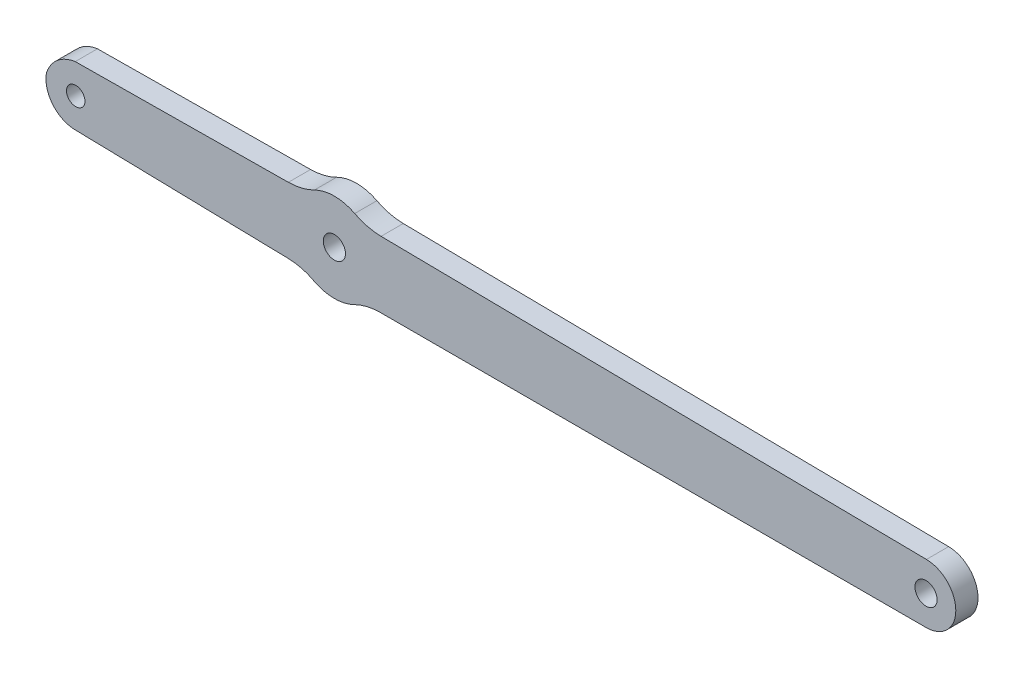
ISO-10303-21;
HEADER;
FILE_DESCRIPTION(('STEP AP214'),'2;1');
FILE_NAME('part.step','',(''),(''),'','','');
FILE_SCHEMA(('AUTOMOTIVE_DESIGN { 1 0 10303 214 1 1 1 1 }'));
ENDSEC;
DATA;
#1=APPLICATION_CONTEXT('core data for automotive mechanical design processes');
#2=APPLICATION_PROTOCOL_DEFINITION('international standard','automotive_design',2000,#1);
#3=PRODUCT_CONTEXT('',#1,'mechanical');
#4=PRODUCT('Part','Part','',(#3));
#5=PRODUCT_RELATED_PRODUCT_CATEGORY('part','',(#4));
#6=PRODUCT_DEFINITION_FORMATION('','',#4);
#7=PRODUCT_DEFINITION_CONTEXT('part definition',#1,'design');
#8=PRODUCT_DEFINITION('design','',#6,#7);
#9=PRODUCT_DEFINITION_SHAPE('','',#8);
#10=(LENGTH_UNIT() NAMED_UNIT(*) SI_UNIT(.MILLI.,.METRE.));
#11=(NAMED_UNIT(*) PLANE_ANGLE_UNIT() SI_UNIT($,.RADIAN.));
#12=(NAMED_UNIT(*) SI_UNIT($,.STERADIAN.) SOLID_ANGLE_UNIT());
#13=UNCERTAINTY_MEASURE_WITH_UNIT(LENGTH_MEASURE(1.E-05),#10,'distance_accuracy_value','');
#14=(GEOMETRIC_REPRESENTATION_CONTEXT(3) GLOBAL_UNCERTAINTY_ASSIGNED_CONTEXT((#13)) GLOBAL_UNIT_ASSIGNED_CONTEXT((#10,
#11,#12)) REPRESENTATION_CONTEXT('',''));
#15=CARTESIAN_POINT('',(0.,0.,0.));
#16=DIRECTION('',(0.,0.,1.));
#17=DIRECTION('',(1.,0.,0.));
#18=AXIS2_PLACEMENT_3D('',#15,#16,#17);
#19=CARTESIAN_POINT('',(281.772915584096,152.423239641116,3.));
#20=DIRECTION('',(0.,0.,1.));
#21=DIRECTION('',(1.,0.,0.));
#22=AXIS2_PLACEMENT_3D('',#19,#20,#21);
#23=PLANE('',#22);
#24=CARTESIAN_POINT('',(201.748350523877,152.944502056133,3.));
#25=DIRECTION('',(0.,0.,1.));
#26=DIRECTION('',(1.,0.,0.));
#27=AXIS2_PLACEMENT_3D('',#24,#25,#26);
#28=CIRCLE('',#27,1.5);
#29=CARTESIAN_POINT('',(203.248350523877,152.944502056133,3.));
#30=VERTEX_POINT('',#29);
#31=EDGE_CURVE('E266',#30,#30,#28,.T.);
#32=ORIENTED_EDGE('',*,*,#31,.F.);
#33=EDGE_LOOP('',(#32));
#34=FACE_BOUND('',#33,.T.);
#35=DIRECTION('',(0.9999999979286,6.43645915177105E-05,0.));
#36=VECTOR('',#35,1.);
#37=CARTESIAN_POINT('',(273.299347779071,148.423065382531,3.));
#38=LINE('',#37,#36);
#39=CARTESIAN_POINT('',(208.001547460763,148.418862516295,3.));
#40=VERTEX_POINT('',#39);
#41=CARTESIAN_POINT('',(281.799361624843,148.423612482449,3.));
#42=VERTEX_POINT('',#41);
#43=EDGE_CURVE('E50',#40,#42,#38,.T.);
#44=ORIENTED_EDGE('',*,*,#43,.T.);
#45=CARTESIAN_POINT('',(281.772915584096,152.423239641116,3.));
#46=DIRECTION('',(0.,0.,1.));
#47=DIRECTION('',(1.,0.,0.));
#48=AXIS2_PLACEMENT_3D('',#45,#46,#47);
#49=CIRCLE('',#48,3.99971458999486);
#50=CARTESIAN_POINT('',(281.799039077792,156.422868919498,3.));
#51=VERTEX_POINT('',#50);
#52=EDGE_CURVE('E259',#42,#51,#49,.T.);
#53=ORIENTED_EDGE('',*,*,#52,.T.);
#54=DIRECTION('',(-0.999914327574007,0.0130895955713542,0.));
#55=VECTOR('',#54,1.);
#56=CARTESIAN_POINT('',(281.799039077792,156.422868919498,3.));
#57=LINE('',#56,#55);
#58=CARTESIAN_POINT('',(208.059957025033,157.388166380747,3.));
#59=VERTEX_POINT('',#58);
#60=EDGE_CURVE('E215',#51,#59,#57,.T.);
#61=ORIENTED_EDGE('',*,*,#60,.T.);
#62=CARTESIAN_POINT('',(208.164874301942,165.388122879638,3.));
#63=DIRECTION('',(0.,0.,-1.));
#64=DIRECTION('',(1.,0.,0.));
#65=AXIS2_PLACEMENT_3D('',#62,#63,#64);
#66=CIRCLE('',#65,8.0006444502392);
#67=CARTESIAN_POINT('',(204.498188507489,158.277164652795,3.));
#68=VERTEX_POINT('',#67);
#69=EDGE_CURVE('E234',#59,#68,#66,.T.);
#70=ORIENTED_EDGE('',*,*,#69,.T.);
#71=CARTESIAN_POINT('',(201.748291362137,152.944826169237,3.));
#72=DIRECTION('',(0.,0.,1.));
#73=DIRECTION('',(1.,0.,0.));
#74=AXIS2_PLACEMENT_3D('',#71,#72,#73);
#75=CIRCLE('',#74,5.99964732407237);
#76=CARTESIAN_POINT('',(199.049261051765,158.303091130672,3.));
#77=VERTEX_POINT('',#76);
#78=EDGE_CURVE('E231',#68,#77,#75,.T.);
#79=ORIENTED_EDGE('',*,*,#78,.T.);
#80=CARTESIAN_POINT('',(195.446483359954,165.464583115021,3.));
#81=DIRECTION('',(0.,0.,-1.));
#82=DIRECTION('',(1.,0.,0.));
#83=AXIS2_PLACEMENT_3D('',#80,#81,#82);
#84=CIRCLE('',#83,8.01666854363488);
#85=CARTESIAN_POINT('',(195.527170705693,157.448320638608,3.));
#86=VERTEX_POINT('',#85);
#87=EDGE_CURVE('E233',#77,#86,#84,.T.);
#88=ORIENTED_EDGE('',*,*,#87,.T.);
#89=DIRECTION('',(-0.999954125619551,-0.00957844749632592,0.));
#90=VECTOR('',#89,1.);
#91=CARTESIAN_POINT('',(195.527170705693,157.448320638608,3.));
#92=LINE('',#91,#90);
#93=CARTESIAN_POINT('',(166.710788830161,157.172291775126,3.));
#94=VERTEX_POINT('',#93);
#95=EDGE_CURVE('E236',#86,#94,#92,.T.);
#96=ORIENTED_EDGE('',*,*,#95,.T.);
#97=CARTESIAN_POINT('',(167.348845761118,152.45935869731,3.));
#98=DIRECTION('',(0.,0.,1.));
#99=DIRECTION('',(1.,0.,0.));
#100=AXIS2_PLACEMENT_3D('',#97,#98,#99);
#101=CIRCLE('',#100,4.75592838919132);
#102=CARTESIAN_POINT('',(162.814944056756,153.895530754657,3.));
#103=VERTEX_POINT('',#102);
#104=EDGE_CURVE('E242',#94,#103,#101,.T.);
#105=ORIENTED_EDGE('',*,*,#104,.T.);
#106=CARTESIAN_POINT('',(166.749053074586,153.172471185027,3.));
#107=DIRECTION('',(0.,0.,1.));
#108=DIRECTION('',(1.,0.,0.));
#109=AXIS2_PLACEMENT_3D('',#106,#107,#108);
#110=CIRCLE('',#109,4.00000361317369);
#111=CARTESIAN_POINT('',(166.658683266735,149.173488539,3.));
#112=VERTEX_POINT('',#111);
#113=EDGE_CURVE('E244',#103,#112,#110,.T.);
#114=ORIENTED_EDGE('',*,*,#113,.T.);
#115=DIRECTION('',(0.999744437235561,-0.022606640983402,0.));
#116=VECTOR('',#115,1.);
#117=CARTESIAN_POINT('',(166.658683266735,149.173488539,3.));
#118=LINE('',#117,#116);
#119=CARTESIAN_POINT('',(195.469024019773,148.522017017123,3.));
#120=VERTEX_POINT('',#119);
#121=EDGE_CURVE('E141',#112,#120,#118,.T.);
#122=ORIENTED_EDGE('',*,*,#121,.T.);
#123=CARTESIAN_POINT('',(195.404462461964,140.977557248785,3.));
#124=DIRECTION('',(0.,0.,-1.));
#125=DIRECTION('',(1.,0.,0.));
#126=AXIS2_PLACEMENT_3D('',#123,#124,#125);
#127=CIRCLE('',#126,7.54473600537629);
#128=CARTESIAN_POINT('',(198.979735895979,147.621386059256,3.));
#129=VERTEX_POINT('',#128);
#130=EDGE_CURVE('E135',#120,#129,#127,.T.);
#131=ORIENTED_EDGE('',*,*,#130,.T.);
#132=CARTESIAN_POINT('',(201.748298232716,152.944482473481,3.));
#133=DIRECTION('',(0.,0.,1.));
#134=DIRECTION('',(1.,0.,0.));
#135=AXIS2_PLACEMENT_3D('',#132,#133,#134);
#136=CIRCLE('',#135,6.00002440391188);
#137=CARTESIAN_POINT('',(204.428513331861,147.576359908761,3.));
#138=VERTEX_POINT('',#137);
#139=EDGE_CURVE('E139',#129,#138,#136,.T.);
#140=ORIENTED_EDGE('',*,*,#139,.T.);
#141=CARTESIAN_POINT('',(208.002206612325,140.418238095968,3.));
#142=DIRECTION('',(0.,0.,-1.));
#143=DIRECTION('',(1.,0.,0.));
#144=AXIS2_PLACEMENT_3D('',#141,#142,#143);
#145=CIRCLE('',#144,8.00062444748054);
#146=EDGE_CURVE('E155',#138,#40,#145,.T.);
#147=ORIENTED_EDGE('',*,*,#146,.T.);
#148=EDGE_LOOP('',(#44,#53,#61,#70,#79,#88,#96,#105,#114,#122,#131,#140,#147));
#149=FACE_BOUND('',#148,.T.);
#150=CARTESIAN_POINT('',(281.74663143718,152.423262481954,3.));
#151=DIRECTION('',(0.,0.,1.));
#152=DIRECTION('',(1.,0.,0.));
#153=AXIS2_PLACEMENT_3D('',#150,#151,#152);
#154=CIRCLE('',#153,1.50000000000009);
#155=CARTESIAN_POINT('',(283.24663143718,152.423262481954,3.));
#156=VERTEX_POINT('',#155);
#157=EDGE_CURVE('E164',#156,#156,#154,.T.);
#158=ORIENTED_EDGE('',*,*,#157,.F.);
#159=EDGE_LOOP('',(#158));
#160=FACE_BOUND('',#159,.T.);
#161=CARTESIAN_POINT('',(166.775315589097,153.179339639449,3.));
#162=DIRECTION('',(0.,0.,1.));
#163=DIRECTION('',(1.,0.,0.));
#164=AXIS2_PLACEMENT_3D('',#161,#162,#163);
#165=CIRCLE('',#164,1.25000000000001);
#166=CARTESIAN_POINT('',(168.025315589097,153.179339639449,3.));
#167=VERTEX_POINT('',#166);
#168=EDGE_CURVE('E272',#167,#167,#165,.T.);
#169=ORIENTED_EDGE('',*,*,#168,.F.);
#170=EDGE_LOOP('',(#169));
#171=FACE_BOUND('',#170,.T.);
#172=ADVANCED_FACE('F33',(#34,#149,#160,#171),#23,.T.);
#173=CARTESIAN_POINT('',(281.772915584096,152.423239641116,0.));
#174=DIRECTION('',(0.,0.,1.));
#175=DIRECTION('',(1.,0.,0.));
#176=AXIS2_PLACEMENT_3D('',#173,#174,#175);
#177=PLANE('',#176);
#178=CARTESIAN_POINT('',(281.772915584096,152.423239641116,0.));
#179=DIRECTION('',(0.,0.,1.));
#180=DIRECTION('',(1.,0.,0.));
#181=AXIS2_PLACEMENT_3D('',#178,#179,#180);
#182=CIRCLE('',#181,3.99971458999486);
#183=CARTESIAN_POINT('',(281.799361624843,148.423612482449,0.));
#184=VERTEX_POINT('',#183);
#185=CARTESIAN_POINT('',(281.799039077792,156.422868919498,0.));
#186=VERTEX_POINT('',#185);
#187=EDGE_CURVE('E161',#184,#186,#182,.T.);
#188=ORIENTED_EDGE('',*,*,#187,.F.);
#189=DIRECTION('',(0.9999999979286,6.43645912575713E-05,0.));
#190=VECTOR('',#189,1.);
#191=CARTESIAN_POINT('',(245.400454541767,148.421269681667,0.));
#192=LINE('',#191,#190);
#193=CARTESIAN_POINT('',(208.001547460763,148.418862516295,0.));
#194=VERTEX_POINT('',#193);
#195=EDGE_CURVE('E102',#194,#184,#192,.T.);
#196=ORIENTED_EDGE('',*,*,#195,.F.);
#197=CARTESIAN_POINT('',(208.002206612325,140.418238095968,0.));
#198=DIRECTION('',(0.,0.,-1.));
#199=DIRECTION('',(1.,0.,0.));
#200=AXIS2_PLACEMENT_3D('',#197,#198,#199);
#201=CIRCLE('',#200,8.00062444748054);
#202=CARTESIAN_POINT('',(204.428513331861,147.576359908761,0.));
#203=VERTEX_POINT('',#202);
#204=EDGE_CURVE('E182',#203,#194,#201,.T.);
#205=ORIENTED_EDGE('',*,*,#204,.F.);
#206=CARTESIAN_POINT('',(201.748298232716,152.944482473481,0.));
#207=DIRECTION('',(0.,0.,1.));
#208=DIRECTION('',(1.,0.,0.));
#209=AXIS2_PLACEMENT_3D('',#206,#207,#208);
#210=CIRCLE('',#209,6.00002440391188);
#211=CARTESIAN_POINT('',(198.979735895979,147.621386059256,0.));
#212=VERTEX_POINT('',#211);
#213=EDGE_CURVE('E95',#212,#203,#210,.T.);
#214=ORIENTED_EDGE('',*,*,#213,.F.);
#215=CARTESIAN_POINT('',(195.404462461964,140.977557248785,0.));
#216=DIRECTION('',(0.,0.,-1.));
#217=DIRECTION('',(1.,0.,0.));
#218=AXIS2_PLACEMENT_3D('',#215,#216,#217);
#219=CIRCLE('',#218,7.54473600537629);
#220=CARTESIAN_POINT('',(195.469024019773,148.522017017123,0.));
#221=VERTEX_POINT('',#220);
#222=EDGE_CURVE('E149',#221,#212,#219,.T.);
#223=ORIENTED_EDGE('',*,*,#222,.F.);
#224=DIRECTION('',(0.999744437235561,-0.022606640983402,0.));
#225=VECTOR('',#224,1.);
#226=CARTESIAN_POINT('',(166.658683266735,149.173488539,0.));
#227=LINE('',#226,#225);
#228=CARTESIAN_POINT('',(166.658683266735,149.173488539,0.));
#229=VERTEX_POINT('',#228);
#230=EDGE_CURVE('E178',#229,#221,#227,.T.);
#231=ORIENTED_EDGE('',*,*,#230,.F.);
#232=CARTESIAN_POINT('',(166.749053074586,153.172471185027,0.));
#233=DIRECTION('',(0.,0.,1.));
#234=DIRECTION('',(1.,0.,0.));
#235=AXIS2_PLACEMENT_3D('',#232,#233,#234);
#236=CIRCLE('',#235,4.00000361317369);
#237=CARTESIAN_POINT('',(162.814944056756,153.895530754657,0.));
#238=VERTEX_POINT('',#237);
#239=EDGE_CURVE('E176',#238,#229,#236,.T.);
#240=ORIENTED_EDGE('',*,*,#239,.F.);
#241=CARTESIAN_POINT('',(167.348845761118,152.45935869731,0.));
#242=DIRECTION('',(0.,0.,1.));
#243=DIRECTION('',(1.,0.,0.));
#244=AXIS2_PLACEMENT_3D('',#241,#242,#243);
#245=CIRCLE('',#244,4.75592838919132);
#246=CARTESIAN_POINT('',(166.710788830161,157.172291775126,0.));
#247=VERTEX_POINT('',#246);
#248=EDGE_CURVE('E174',#247,#238,#245,.T.);
#249=ORIENTED_EDGE('',*,*,#248,.F.);
#250=DIRECTION('',(-0.999954125619551,-0.00957844749632592,0.));
#251=VECTOR('',#250,1.);
#252=CARTESIAN_POINT('',(195.527170705693,157.448320638608,0.));
#253=LINE('',#252,#251);
#254=CARTESIAN_POINT('',(195.527170705693,157.448320638608,0.));
#255=VERTEX_POINT('',#254);
#256=EDGE_CURVE('E172',#255,#247,#253,.T.);
#257=ORIENTED_EDGE('',*,*,#256,.F.);
#258=CARTESIAN_POINT('',(195.446483359954,165.464583115021,0.));
#259=DIRECTION('',(0.,0.,-1.));
#260=DIRECTION('',(1.,0.,0.));
#261=AXIS2_PLACEMENT_3D('',#258,#259,#260);
#262=CIRCLE('',#261,8.01666854363488);
#263=CARTESIAN_POINT('',(199.049261051765,158.303091130672,0.));
#264=VERTEX_POINT('',#263);
#265=EDGE_CURVE('E170',#264,#255,#262,.T.);
#266=ORIENTED_EDGE('',*,*,#265,.F.);
#267=CARTESIAN_POINT('',(201.748291362137,152.944826169237,0.));
#268=DIRECTION('',(0.,0.,1.));
#269=DIRECTION('',(1.,0.,0.));
#270=AXIS2_PLACEMENT_3D('',#267,#268,#269);
#271=CIRCLE('',#270,5.99964732407237);
#272=CARTESIAN_POINT('',(204.498188507489,158.277164652795,0.));
#273=VERTEX_POINT('',#272);
#274=EDGE_CURVE('E168',#273,#264,#271,.T.);
#275=ORIENTED_EDGE('',*,*,#274,.F.);
#276=CARTESIAN_POINT('',(208.164874301942,165.388122879638,0.));
#277=DIRECTION('',(0.,0.,-1.));
#278=DIRECTION('',(1.,0.,0.));
#279=AXIS2_PLACEMENT_3D('',#276,#277,#278);
#280=CIRCLE('',#279,8.0006444502392);
#281=CARTESIAN_POINT('',(208.059957025033,157.388166380747,0.));
#282=VERTEX_POINT('',#281);
#283=EDGE_CURVE('E166',#282,#273,#280,.T.);
#284=ORIENTED_EDGE('',*,*,#283,.F.);
#285=DIRECTION('',(-0.999914327574007,0.0130895955713542,0.));
#286=VECTOR('',#285,1.);
#287=CARTESIAN_POINT('',(281.799039077792,156.422868919498,0.));
#288=LINE('',#287,#286);
#289=EDGE_CURVE('E163',#186,#282,#288,.T.);
#290=ORIENTED_EDGE('',*,*,#289,.F.);
#291=EDGE_LOOP('',(#188,#196,#205,#214,#223,#231,#240,#249,#257,#266,#275,#284,#290));
#292=FACE_BOUND('',#291,.T.);
#293=CARTESIAN_POINT('',(281.74663143718,152.423262481954,0.));
#294=DIRECTION('',(0.,0.,1.));
#295=DIRECTION('',(1.,0.,0.));
#296=AXIS2_PLACEMENT_3D('',#293,#294,#295);
#297=CIRCLE('',#296,1.50000000000009);
#298=CARTESIAN_POINT('',(283.24663143718,152.423262481954,0.));
#299=VERTEX_POINT('',#298);
#300=EDGE_CURVE('E263',#299,#299,#297,.T.);
#301=ORIENTED_EDGE('',*,*,#300,.T.);
#302=EDGE_LOOP('',(#301));
#303=FACE_BOUND('',#302,.T.);
#304=CARTESIAN_POINT('',(201.748350523877,152.944502056133,0.));
#305=DIRECTION('',(0.,0.,1.));
#306=DIRECTION('',(1.,0.,0.));
#307=AXIS2_PLACEMENT_3D('',#304,#305,#306);
#308=CIRCLE('',#307,1.5);
#309=CARTESIAN_POINT('',(203.248350523877,152.944502056133,0.));
#310=VERTEX_POINT('',#309);
#311=EDGE_CURVE('E269',#310,#310,#308,.T.);
#312=ORIENTED_EDGE('',*,*,#311,.T.);
#313=EDGE_LOOP('',(#312));
#314=FACE_BOUND('',#313,.T.);
#315=CARTESIAN_POINT('',(166.775315589097,153.179339639449,0.));
#316=DIRECTION('',(0.,0.,1.));
#317=DIRECTION('',(1.,0.,0.));
#318=AXIS2_PLACEMENT_3D('',#315,#316,#317);
#319=CIRCLE('',#318,1.25000000000001);
#320=CARTESIAN_POINT('',(168.025315589097,153.179339639449,0.));
#321=VERTEX_POINT('',#320);
#322=EDGE_CURVE('E275',#321,#321,#319,.T.);
#323=ORIENTED_EDGE('',*,*,#322,.T.);
#324=EDGE_LOOP('',(#323));
#325=FACE_BOUND('',#324,.T.);
#326=ADVANCED_FACE('F219',(#292,#303,#314,#325),#177,.F.);
#327=CARTESIAN_POINT('',(281.772915584096,152.423239641116,3.));
#328=DIRECTION('',(0.,0.,-1.));
#329=DIRECTION('',(-1.,0.,0.));
#330=AXIS2_PLACEMENT_3D('',#327,#328,#329);
#331=CYLINDRICAL_SURFACE('',#330,3.99971458999486);
#332=ORIENTED_EDGE('',*,*,#187,.T.);
#333=DIRECTION('',(0.,0.,-1.));
#334=VECTOR('',#333,1.);
#335=CARTESIAN_POINT('',(281.799039077792,156.422868919498,3.));
#336=LINE('',#335,#334);
#337=EDGE_CURVE('E42',#51,#186,#336,.T.);
#338=ORIENTED_EDGE('',*,*,#337,.F.);
#339=ORIENTED_EDGE('',*,*,#52,.F.);
#340=DIRECTION('',(0.,0.,-1.));
#341=VECTOR('',#340,1.);
#342=CARTESIAN_POINT('',(281.799361624843,148.423612482449,3.));
#343=LINE('',#342,#341);
#344=EDGE_CURVE('E11',#42,#184,#343,.T.);
#345=ORIENTED_EDGE('',*,*,#344,.T.);
#346=EDGE_LOOP('',(#332,#338,#339,#345));
#347=FACE_BOUND('',#346,.T.);
#348=ADVANCED_FACE('F35',(#347),#331,.T.);
#349=CARTESIAN_POINT('',(281.799039077792,156.422868919498,3.));
#350=DIRECTION('',(-0.0130895955713542,-0.999914327574007,0.));
#351=DIRECTION('',(0.999914327574007,-0.0130895955713542,0.));
#352=AXIS2_PLACEMENT_3D('',#349,#350,#351);
#353=PLANE('',#352);
#354=ORIENTED_EDGE('',*,*,#289,.T.);
#355=DIRECTION('',(0.,0.,-1.));
#356=VECTOR('',#355,1.);
#357=CARTESIAN_POINT('',(208.059957025033,157.388166380747,3.));
#358=LINE('',#357,#356);
#359=EDGE_CURVE('E206',#59,#282,#358,.T.);
#360=ORIENTED_EDGE('',*,*,#359,.F.);
#361=ORIENTED_EDGE('',*,*,#60,.F.);
#362=ORIENTED_EDGE('',*,*,#337,.T.);
#363=EDGE_LOOP('',(#354,#360,#361,#362));
#364=FACE_BOUND('',#363,.T.);
#365=ADVANCED_FACE('F213',(#364),#353,.F.);
#366=CARTESIAN_POINT('',(208.164874301942,165.388122879638,3.));
#367=DIRECTION('',(0.,0.,-1.));
#368=DIRECTION('',(-1.,0.,0.));
#369=AXIS2_PLACEMENT_3D('',#366,#367,#368);
#370=CYLINDRICAL_SURFACE('',#369,8.0006444502392);
#371=ORIENTED_EDGE('',*,*,#283,.T.);
#372=DIRECTION('',(0.,0.,-1.));
#373=VECTOR('',#372,1.);
#374=CARTESIAN_POINT('',(204.498188507489,158.277164652795,3.));
#375=LINE('',#374,#373);
#376=EDGE_CURVE('E203',#68,#273,#375,.T.);
#377=ORIENTED_EDGE('',*,*,#376,.F.);
#378=ORIENTED_EDGE('',*,*,#69,.F.);
#379=ORIENTED_EDGE('',*,*,#359,.T.);
#380=EDGE_LOOP('',(#371,#377,#378,#379));
#381=FACE_BOUND('',#380,.T.);
#382=ADVANCED_FACE('F225',(#381),#370,.F.);
#383=CARTESIAN_POINT('',(201.748291362137,152.944826169237,3.));
#384=DIRECTION('',(0.,0.,-1.));
#385=DIRECTION('',(-1.,0.,0.));
#386=AXIS2_PLACEMENT_3D('',#383,#384,#385);
#387=CYLINDRICAL_SURFACE('',#386,5.99964732407237);
#388=ORIENTED_EDGE('',*,*,#274,.T.);
#389=DIRECTION('',(0.,0.,-1.));
#390=VECTOR('',#389,1.);
#391=CARTESIAN_POINT('',(199.049261051765,158.303091130672,3.));
#392=LINE('',#391,#390);
#393=EDGE_CURVE('E200',#77,#264,#392,.T.);
#394=ORIENTED_EDGE('',*,*,#393,.F.);
#395=ORIENTED_EDGE('',*,*,#78,.F.);
#396=ORIENTED_EDGE('',*,*,#376,.T.);
#397=EDGE_LOOP('',(#388,#394,#395,#396));
#398=FACE_BOUND('',#397,.T.);
#399=ADVANCED_FACE('F229',(#398),#387,.T.);
#400=CARTESIAN_POINT('',(195.446483359954,165.464583115021,3.));
#401=DIRECTION('',(0.,0.,-1.));
#402=DIRECTION('',(-1.,0.,0.));
#403=AXIS2_PLACEMENT_3D('',#400,#401,#402);
#404=CYLINDRICAL_SURFACE('',#403,8.01666854363488);
#405=ORIENTED_EDGE('',*,*,#265,.T.);
#406=DIRECTION('',(0.,0.,-1.));
#407=VECTOR('',#406,1.);
#408=CARTESIAN_POINT('',(195.527170705693,157.448320638608,3.));
#409=LINE('',#408,#407);
#410=EDGE_CURVE('E197',#86,#255,#409,.T.);
#411=ORIENTED_EDGE('',*,*,#410,.F.);
#412=ORIENTED_EDGE('',*,*,#87,.F.);
#413=ORIENTED_EDGE('',*,*,#393,.T.);
#414=EDGE_LOOP('',(#405,#411,#412,#413));
#415=FACE_BOUND('',#414,.T.);
#416=ADVANCED_FACE('F315',(#415),#404,.F.);
#417=CARTESIAN_POINT('',(195.527170705693,157.448320638608,3.));
#418=DIRECTION('',(0.00957844749632592,-0.999954125619551,0.));
#419=DIRECTION('',(0.999954125619551,0.00957844749632592,0.));
#420=AXIS2_PLACEMENT_3D('',#417,#418,#419);
#421=PLANE('',#420);
#422=ORIENTED_EDGE('',*,*,#256,.T.);
#423=DIRECTION('',(0.,0.,-1.));
#424=VECTOR('',#423,1.);
#425=CARTESIAN_POINT('',(166.710788830161,157.172291775126,3.));
#426=LINE('',#425,#424);
#427=EDGE_CURVE('E194',#94,#247,#426,.T.);
#428=ORIENTED_EDGE('',*,*,#427,.F.);
#429=ORIENTED_EDGE('',*,*,#95,.F.);
#430=ORIENTED_EDGE('',*,*,#410,.T.);
#431=EDGE_LOOP('',(#422,#428,#429,#430));
#432=FACE_BOUND('',#431,.T.);
#433=ADVANCED_FACE('F311',(#432),#421,.F.);
#434=CARTESIAN_POINT('',(167.348845761118,152.45935869731,3.));
#435=DIRECTION('',(0.,0.,-1.));
#436=DIRECTION('',(-1.,0.,0.));
#437=AXIS2_PLACEMENT_3D('',#434,#435,#436);
#438=CYLINDRICAL_SURFACE('',#437,4.75592838919132);
#439=ORIENTED_EDGE('',*,*,#248,.T.);
#440=DIRECTION('',(0.,0.,-1.));
#441=VECTOR('',#440,1.);
#442=CARTESIAN_POINT('',(162.814944056756,153.895530754657,3.));
#443=LINE('',#442,#441);
#444=EDGE_CURVE('E191',#103,#238,#443,.T.);
#445=ORIENTED_EDGE('',*,*,#444,.F.);
#446=ORIENTED_EDGE('',*,*,#104,.F.);
#447=ORIENTED_EDGE('',*,*,#427,.T.);
#448=EDGE_LOOP('',(#439,#445,#446,#447));
#449=FACE_BOUND('',#448,.T.);
#450=ADVANCED_FACE('F308',(#449),#438,.T.);
#451=CARTESIAN_POINT('',(166.749053074586,153.172471185027,3.));
#452=DIRECTION('',(0.,0.,-1.));
#453=DIRECTION('',(-1.,0.,0.));
#454=AXIS2_PLACEMENT_3D('',#451,#452,#453);
#455=CYLINDRICAL_SURFACE('',#454,4.00000361317369);
#456=ORIENTED_EDGE('',*,*,#239,.T.);
#457=DIRECTION('',(0.,0.,-1.));
#458=VECTOR('',#457,1.);
#459=CARTESIAN_POINT('',(166.658683266735,149.173488539,3.));
#460=LINE('',#459,#458);
#461=EDGE_CURVE('E188',#112,#229,#460,.T.);
#462=ORIENTED_EDGE('',*,*,#461,.F.);
#463=ORIENTED_EDGE('',*,*,#113,.F.);
#464=ORIENTED_EDGE('',*,*,#444,.T.);
#465=EDGE_LOOP('',(#456,#462,#463,#464));
#466=FACE_BOUND('',#465,.T.);
#467=ADVANCED_FACE('F250',(#466),#455,.T.);
#468=CARTESIAN_POINT('',(166.658683266735,149.173488539,3.));
#469=DIRECTION('',(0.022606640983402,0.99974443723556,0.));
#470=DIRECTION('',(-0.999744437235561,0.022606640983402,0.));
#471=AXIS2_PLACEMENT_3D('',#468,#469,#470);
#472=PLANE('',#471);
#473=ORIENTED_EDGE('',*,*,#230,.T.);
#474=DIRECTION('',(0.,0.,-1.));
#475=VECTOR('',#474,1.);
#476=CARTESIAN_POINT('',(195.469024019773,148.522017017123,3.));
#477=LINE('',#476,#475);
#478=EDGE_CURVE('E150',#120,#221,#477,.T.);
#479=ORIENTED_EDGE('',*,*,#478,.F.);
#480=ORIENTED_EDGE('',*,*,#121,.F.);
#481=ORIENTED_EDGE('',*,*,#461,.T.);
#482=EDGE_LOOP('',(#473,#479,#480,#481));
#483=FACE_BOUND('',#482,.T.);
#484=ADVANCED_FACE('F254',(#483),#472,.F.);
#485=CARTESIAN_POINT('',(195.404462461964,140.977557248785,3.));
#486=DIRECTION('',(0.,0.,-1.));
#487=DIRECTION('',(-1.,0.,0.));
#488=AXIS2_PLACEMENT_3D('',#485,#486,#487);
#489=CYLINDRICAL_SURFACE('',#488,7.54473600537629);
#490=ORIENTED_EDGE('',*,*,#222,.T.);
#491=DIRECTION('',(0.,0.,-1.));
#492=VECTOR('',#491,1.);
#493=CARTESIAN_POINT('',(198.979735895979,147.621386059256,3.));
#494=LINE('',#493,#492);
#495=EDGE_CURVE('E146',#129,#212,#494,.T.);
#496=ORIENTED_EDGE('',*,*,#495,.F.);
#497=ORIENTED_EDGE('',*,*,#130,.F.);
#498=ORIENTED_EDGE('',*,*,#478,.T.);
#499=EDGE_LOOP('',(#490,#496,#497,#498));
#500=FACE_BOUND('',#499,.T.);
#501=ADVANCED_FACE('F147',(#500),#489,.F.);
#502=CARTESIAN_POINT('',(201.748298232716,152.944482473481,3.));
#503=DIRECTION('',(0.,0.,-1.));
#504=DIRECTION('',(-1.,0.,0.));
#505=AXIS2_PLACEMENT_3D('',#502,#503,#504);
#506=CYLINDRICAL_SURFACE('',#505,6.00002440391188);
#507=ORIENTED_EDGE('',*,*,#213,.T.);
#508=DIRECTION('',(0.,0.,-1.));
#509=VECTOR('',#508,1.);
#510=CARTESIAN_POINT('',(204.428513331861,147.576359908761,3.));
#511=LINE('',#510,#509);
#512=EDGE_CURVE('E151',#138,#203,#511,.T.);
#513=ORIENTED_EDGE('',*,*,#512,.F.);
#514=ORIENTED_EDGE('',*,*,#139,.F.);
#515=ORIENTED_EDGE('',*,*,#495,.T.);
#516=EDGE_LOOP('',(#507,#513,#514,#515));
#517=FACE_BOUND('',#516,.T.);
#518=ADVANCED_FACE('F153',(#517),#506,.T.);
#519=CARTESIAN_POINT('',(208.002206612325,140.418238095968,3.));
#520=DIRECTION('',(0.,0.,-1.));
#521=DIRECTION('',(-1.,0.,0.));
#522=AXIS2_PLACEMENT_3D('',#519,#520,#521);
#523=CYLINDRICAL_SURFACE('',#522,8.00062444748054);
#524=ORIENTED_EDGE('',*,*,#204,.T.);
#525=DIRECTION('',(0.,0.,-1.));
#526=VECTOR('',#525,1.);
#527=CARTESIAN_POINT('',(208.001547460763,148.418862516295,3.));
#528=LINE('',#527,#526);
#529=EDGE_CURVE('E157',#40,#194,#528,.T.);
#530=ORIENTED_EDGE('',*,*,#529,.F.);
#531=ORIENTED_EDGE('',*,*,#146,.F.);
#532=ORIENTED_EDGE('',*,*,#512,.T.);
#533=EDGE_LOOP('',(#524,#530,#531,#532));
#534=FACE_BOUND('',#533,.T.);
#535=ADVANCED_FACE('F257',(#534),#523,.F.);
#536=CARTESIAN_POINT('',(245.400454541767,148.421269681667,3.));
#537=DIRECTION('',(-6.43645912575713E-05,0.9999999979286,0.));
#538=DIRECTION('',(-0.9999999979286,-6.43645912575714E-05,0.));
#539=AXIS2_PLACEMENT_3D('',#536,#537,#538);
#540=PLANE('',#539);
#541=ORIENTED_EDGE('',*,*,#195,.T.);
#542=ORIENTED_EDGE('',*,*,#344,.F.);
#543=ORIENTED_EDGE('',*,*,#43,.F.);
#544=ORIENTED_EDGE('',*,*,#529,.T.);
#545=EDGE_LOOP('',(#541,#542,#543,#544));
#546=FACE_BOUND('',#545,.T.);
#547=ADVANCED_FACE('F258',(#546),#540,.F.);
#548=CARTESIAN_POINT('',(281.74663143718,152.423262481954,3.));
#549=DIRECTION('',(0.,0.,-1.));
#550=DIRECTION('',(-1.,0.,0.));
#551=AXIS2_PLACEMENT_3D('',#548,#549,#550);
#552=CYLINDRICAL_SURFACE('',#551,1.50000000000009);
#553=ORIENTED_EDGE('',*,*,#157,.T.);
#554=EDGE_LOOP('',(#553));
#555=FACE_BOUND('',#554,.T.);
#556=ORIENTED_EDGE('',*,*,#300,.F.);
#557=EDGE_LOOP('',(#556));
#558=FACE_BOUND('',#557,.T.);
#559=ADVANCED_FACE('F293',(#555,#558),#552,.F.);
#560=CARTESIAN_POINT('',(201.748350523877,152.944502056133,3.));
#561=DIRECTION('',(0.,0.,-1.));
#562=DIRECTION('',(-1.,0.,0.));
#563=AXIS2_PLACEMENT_3D('',#560,#561,#562);
#564=CYLINDRICAL_SURFACE('',#563,1.5);
#565=ORIENTED_EDGE('',*,*,#31,.T.);
#566=EDGE_LOOP('',(#565));
#567=FACE_BOUND('',#566,.T.);
#568=ORIENTED_EDGE('',*,*,#311,.F.);
#569=EDGE_LOOP('',(#568));
#570=FACE_BOUND('',#569,.T.);
#571=ADVANCED_FACE('F420',(#567,#570),#564,.F.);
#572=CARTESIAN_POINT('',(166.775315589097,153.179339639449,3.));
#573=DIRECTION('',(0.,0.,-1.));
#574=DIRECTION('',(-1.,0.,0.));
#575=AXIS2_PLACEMENT_3D('',#572,#573,#574);
#576=CYLINDRICAL_SURFACE('',#575,1.25000000000001);
#577=ORIENTED_EDGE('',*,*,#168,.T.);
#578=EDGE_LOOP('',(#577));
#579=FACE_BOUND('',#578,.T.);
#580=ORIENTED_EDGE('',*,*,#322,.F.);
#581=EDGE_LOOP('',(#580));
#582=FACE_BOUND('',#581,.T.);
#583=ADVANCED_FACE('F281',(#579,#582),#576,.F.);
#584=CLOSED_SHELL('',(#172,#326,#348,#365,#382,#399,#416,#433,#450,#467,#484,#501,#518,#535,
#547,#559,#571,#583));
#585=MANIFOLD_SOLID_BREP('B2',#584);
#586=ADVANCED_BREP_SHAPE_REPRESENTATION('',(#18,#585),#14);
#587=SHAPE_DEFINITION_REPRESENTATION(#9,#586);
ENDSEC;
END-ISO-10303-21;
